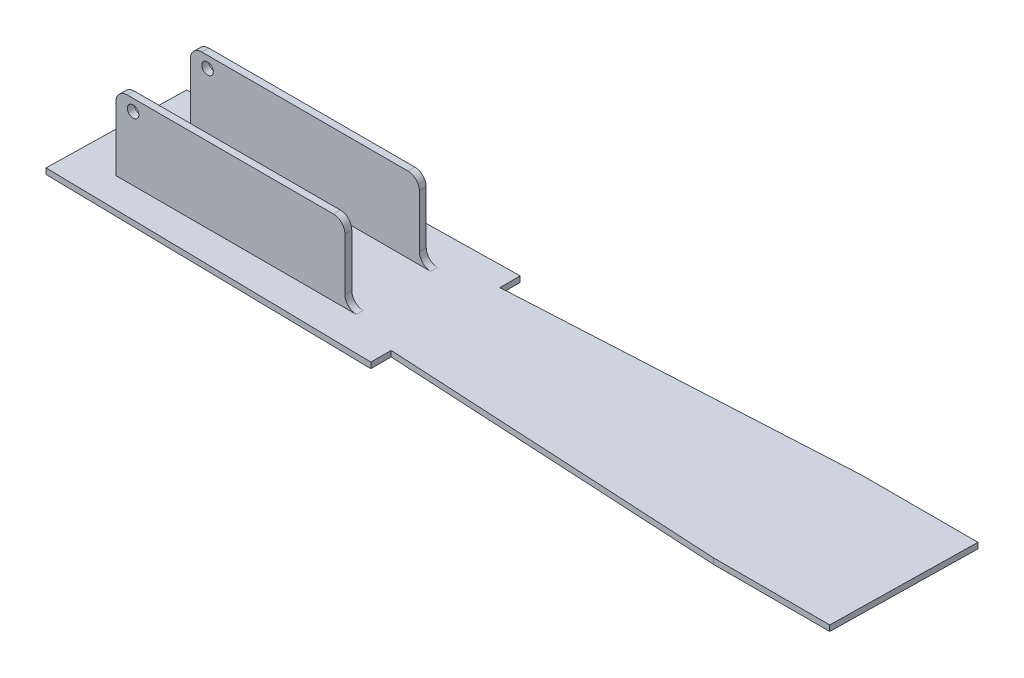
ISO-10303-21;
HEADER;
FILE_DESCRIPTION(('STEP AP214'),'2;1');
FILE_NAME('part.step','',(''),(''),'','','');
FILE_SCHEMA(('AUTOMOTIVE_DESIGN { 1 0 10303 214 1 1 1 1 }'));
ENDSEC;
DATA;
#1=APPLICATION_CONTEXT('core data for automotive mechanical design processes');
#2=APPLICATION_PROTOCOL_DEFINITION('international standard','automotive_design',2000,#1);
#3=PRODUCT_CONTEXT('',#1,'mechanical');
#4=PRODUCT('Part','Part','',(#3));
#5=PRODUCT_RELATED_PRODUCT_CATEGORY('part','',(#4));
#6=PRODUCT_DEFINITION_FORMATION('','',#4);
#7=PRODUCT_DEFINITION_CONTEXT('part definition',#1,'design');
#8=PRODUCT_DEFINITION('design','',#6,#7);
#9=PRODUCT_DEFINITION_SHAPE('','',#8);
#10=(LENGTH_UNIT() NAMED_UNIT(*) SI_UNIT(.MILLI.,.METRE.));
#11=(NAMED_UNIT(*) PLANE_ANGLE_UNIT() SI_UNIT($,.RADIAN.));
#12=(NAMED_UNIT(*) SI_UNIT($,.STERADIAN.) SOLID_ANGLE_UNIT());
#13=UNCERTAINTY_MEASURE_WITH_UNIT(LENGTH_MEASURE(1.E-05),#10,'distance_accuracy_value','');
#14=(GEOMETRIC_REPRESENTATION_CONTEXT(3) GLOBAL_UNCERTAINTY_ASSIGNED_CONTEXT((#13)) GLOBAL_UNIT_ASSIGNED_CONTEXT((#10,
#11,#12)) REPRESENTATION_CONTEXT('',''));
#15=CARTESIAN_POINT('',(0.,0.,0.));
#16=DIRECTION('',(0.,0.,1.));
#17=DIRECTION('',(1.,0.,0.));
#18=AXIS2_PLACEMENT_3D('',#15,#16,#17);
#19=CARTESIAN_POINT('',(0.,1.26999999999999,0.));
#20=DIRECTION('',(0.,-1.,0.));
#21=DIRECTION('',(0.,0.,-1.));
#22=AXIS2_PLACEMENT_3D('',#19,#20,#21);
#23=PLANE('',#22);
#24=CARTESIAN_POINT('',(-58.141999981168,1.26999999999999,-0.00550365632334682));
#25=DIRECTION('',(0.,1.,0.));
#26=DIRECTION('',(0.,0.,1.));
#27=AXIS2_PLACEMENT_3D('',#24,#25,#26);
#28=CIRCLE('',#27,1.27);
#29=CARTESIAN_POINT('',(-58.141999981168,1.26999999999999,1.26449634367665));
#30=VERTEX_POINT('',#29);
#31=EDGE_CURVE('E643',#30,#30,#28,.T.);
#32=ORIENTED_EDGE('',*,*,#31,.F.);
#33=EDGE_LOOP('',(#32));
#34=FACE_BOUND('',#33,.T.);
#35=DIRECTION('',(-1.,0.,0.));
#36=VECTOR('',#35,1.);
#37=CARTESIAN_POINT('',(-78.418825687294,1.26999999999999,-9.02250365632318));
#38=LINE('',#37,#36);
#39=CARTESIAN_POINT('',(-25.078825687294,1.26999999999999,-9.02250365632318));
#40=VERTEX_POINT('',#39);
#41=CARTESIAN_POINT('',(-78.418825687294,1.26999999999999,-9.02250365632318));
#42=VERTEX_POINT('',#41);
#43=EDGE_CURVE('E237',#40,#42,#38,.T.);
#44=ORIENTED_EDGE('',*,*,#43,.F.);
#45=DIRECTION('',(0.,0.,-1.));
#46=VECTOR('',#45,1.);
#47=CARTESIAN_POINT('',(-25.078825687294,1.26999999999999,-7.49850365632332));
#48=LINE('',#47,#46);
#49=CARTESIAN_POINT('',(-25.078825687294,1.26999999999999,-7.49850365632332));
#50=VERTEX_POINT('',#49);
#51=EDGE_CURVE('E405',#40,#50,#48,.F.);
#52=ORIENTED_EDGE('',*,*,#51,.T.);
#53=DIRECTION('',(1.,0.,0.));
#54=VECTOR('',#53,1.);
#55=CARTESIAN_POINT('',(-78.418825687294,1.26999999999999,-7.49850365632332));
#56=LINE('',#55,#54);
#57=CARTESIAN_POINT('',(-78.418825687294,1.26999999999999,-7.49850365632332));
#58=VERTEX_POINT('',#57);
#59=EDGE_CURVE('E260',#58,#50,#56,.T.);
#60=ORIENTED_EDGE('',*,*,#59,.F.);
#61=DIRECTION('',(0.,0.,1.));
#62=VECTOR('',#61,1.);
#63=CARTESIAN_POINT('',(-78.418825687294,1.26999999999999,-9.02250365632318));
#64=LINE('',#63,#62);
#65=EDGE_CURVE('E268',#42,#58,#64,.T.);
#66=ORIENTED_EDGE('',*,*,#65,.F.);
#67=EDGE_LOOP('',(#44,#52,#60,#66));
#68=FACE_BOUND('',#67,.T.);
#69=DIRECTION('',(-1.,0.,0.));
#70=VECTOR('',#69,1.);
#71=CARTESIAN_POINT('',(61.890036883109,1.26999999999999,-16.1607500000001));
#72=LINE('',#71,#70);
#73=CARTESIAN_POINT('',(87.6673042407577,1.26999999999999,-16.1607500000001));
#74=VERTEX_POINT('',#73);
#75=CARTESIAN_POINT('',(61.890036883109,1.26999999999999,-16.1607500000001));
#76=VERTEX_POINT('',#75);
#77=EDGE_CURVE('E288',#74,#76,#72,.T.);
#78=ORIENTED_EDGE('',*,*,#77,.T.);
#79=DIRECTION('',(-0.998558591239147,0.,0.0536725242791041));
#80=VECTOR('',#79,1.);
#81=CARTESIAN_POINT('',(-14.309963116891,1.26999999999999,-12.065));
#82=LINE('',#81,#80);
#83=CARTESIAN_POINT('',(-14.309963116891,1.26999999999999,-12.065));
#84=VERTEX_POINT('',#83);
#85=EDGE_CURVE('E292',#76,#84,#82,.T.);
#86=ORIENTED_EDGE('',*,*,#85,.T.);
#87=DIRECTION('',(0.,0.,-1.));
#88=VECTOR('',#87,1.);
#89=CARTESIAN_POINT('',(-14.309963116891,1.26999999999999,-16.5700759475302));
#90=LINE('',#89,#88);
#91=CARTESIAN_POINT('',(-14.309963116891,1.26999999999999,-16.5700759475302));
#92=VERTEX_POINT('',#91);
#93=EDGE_CURVE('E296',#84,#92,#90,.T.);
#94=ORIENTED_EDGE('',*,*,#93,.T.);
#95=DIRECTION('',(-0.999847695156391,0.,0.0174524064372836));
#96=VECTOR('',#95,1.);
#97=CARTESIAN_POINT('',(-87.0366957215782,1.26999999999999,-15.3006261078983));
#98=LINE('',#97,#96);
#99=CARTESIAN_POINT('',(-87.0366957215782,1.26999999999999,-15.3006261078983));
#100=VERTEX_POINT('',#99);
#101=EDGE_CURVE('E299',#92,#100,#98,.T.);
#102=ORIENTED_EDGE('',*,*,#101,.T.);
#103=DIRECTION('',(-0.020610314510683,0.,0.9997875849078));
#104=VECTOR('',#103,1.);
#105=CARTESIAN_POINT('',(-87.6673042407577,1.26999999999999,15.2896187952516));
#106=LINE('',#105,#104);
#107=CARTESIAN_POINT('',(-87.6673042407577,1.26999999999999,15.2896187952516));
#108=VERTEX_POINT('',#107);
#109=EDGE_CURVE('E302',#100,#108,#106,.T.);
#110=ORIENTED_EDGE('',*,*,#109,.T.);
#111=DIRECTION('',(0.999847695156391,0.,0.0174524064372836));
#112=VECTOR('',#111,1.);
#113=CARTESIAN_POINT('',(-14.309963116891,1.26999999999999,16.5700759475302));
#114=LINE('',#113,#112);
#115=CARTESIAN_POINT('',(-14.309963116891,1.26999999999999,16.5700759475302));
#116=VERTEX_POINT('',#115);
#117=EDGE_CURVE('E305',#108,#116,#114,.T.);
#118=ORIENTED_EDGE('',*,*,#117,.T.);
#119=DIRECTION('',(0.,0.,-1.));
#120=VECTOR('',#119,1.);
#121=CARTESIAN_POINT('',(-14.309963116891,1.26999999999999,12.065));
#122=LINE('',#121,#120);
#123=CARTESIAN_POINT('',(-14.309963116891,1.26999999999999,12.065));
#124=VERTEX_POINT('',#123);
#125=EDGE_CURVE('E308',#116,#124,#122,.T.);
#126=ORIENTED_EDGE('',*,*,#125,.T.);
#127=DIRECTION('',(0.998536688659021,0.,0.0540784744780849));
#128=VECTOR('',#127,1.);
#129=CARTESIAN_POINT('',(61.3163684696733,1.26999999999999,16.1607500000001));
#130=LINE('',#129,#128);
#131=CARTESIAN_POINT('',(61.3163684696733,1.26999999999999,16.1607500000001));
#132=VERTEX_POINT('',#131);
#133=EDGE_CURVE('E311',#124,#132,#130,.T.);
#134=ORIENTED_EDGE('',*,*,#133,.T.);
#135=DIRECTION('',(1.,0.,0.));
#136=VECTOR('',#135,1.);
#137=CARTESIAN_POINT('',(87.0936358273219,1.26999999999999,16.1607500000001));
#138=LINE('',#137,#136);
#139=CARTESIAN_POINT('',(87.0936358273219,1.26999999999999,16.1607500000001));
#140=VERTEX_POINT('',#139);
#141=EDGE_CURVE('E314',#132,#140,#138,.T.);
#142=ORIENTED_EDGE('',*,*,#141,.T.);
#143=DIRECTION('',(0.0177460228056984,0.,-0.999842526938407));
#144=VECTOR('',#143,1.);
#145=CARTESIAN_POINT('',(87.6673042407577,1.26999999999999,-16.1607500000001));
#146=LINE('',#145,#144);
#147=EDGE_CURVE('E317',#140,#74,#146,.T.);
#148=ORIENTED_EDGE('',*,*,#147,.T.);
#149=EDGE_LOOP('',(#78,#86,#94,#102,#110,#118,#126,#134,#142,#148));
#150=FACE_BOUND('',#149,.T.);
#151=DIRECTION('',(-1.,0.,0.));
#152=VECTOR('',#151,1.);
#153=CARTESIAN_POINT('',(-78.418825687294,1.26999999999999,7.49850365632332));
#154=LINE('',#153,#152);
#155=CARTESIAN_POINT('',(-25.078825687294,1.26999999999999,7.49850365632332));
#156=VERTEX_POINT('',#155);
#157=CARTESIAN_POINT('',(-78.418825687294,1.26999999999999,7.49850365632332));
#158=VERTEX_POINT('',#157);
#159=EDGE_CURVE('E233',#156,#158,#154,.T.);
#160=ORIENTED_EDGE('',*,*,#159,.F.);
#161=DIRECTION('',(0.,0.,-1.));
#162=VECTOR('',#161,1.);
#163=CARTESIAN_POINT('',(-25.078825687294,1.26999999999999,9.0225036563234));
#164=LINE('',#163,#162);
#165=CARTESIAN_POINT('',(-25.078825687294,1.26999999999999,9.0225036563234));
#166=VERTEX_POINT('',#165);
#167=EDGE_CURVE('E402',#156,#166,#164,.F.);
#168=ORIENTED_EDGE('',*,*,#167,.T.);
#169=DIRECTION('',(1.,0.,0.));
#170=VECTOR('',#169,1.);
#171=CARTESIAN_POINT('',(-78.418825687294,1.26999999999999,9.0225036563234));
#172=LINE('',#171,#170);
#173=CARTESIAN_POINT('',(-78.418825687294,1.26999999999999,9.0225036563234));
#174=VERTEX_POINT('',#173);
#175=EDGE_CURVE('E235',#174,#166,#172,.T.);
#176=ORIENTED_EDGE('',*,*,#175,.F.);
#177=DIRECTION('',(0.,0.,1.));
#178=VECTOR('',#177,1.);
#179=CARTESIAN_POINT('',(-78.418825687294,1.26999999999999,9.0225036563234));
#180=LINE('',#179,#178);
#181=EDGE_CURVE('E222',#158,#174,#180,.T.);
#182=ORIENTED_EDGE('',*,*,#181,.F.);
#183=EDGE_LOOP('',(#160,#168,#176,#182));
#184=FACE_BOUND('',#183,.T.);
#185=ADVANCED_FACE('F59',(#34,#68,#150,#184),#23,.F.);
#186=CARTESIAN_POINT('',(61.890036883109,1.26999999999999,-16.1607500000001));
#187=DIRECTION('',(0.,0.,1.));
#188=DIRECTION('',(1.,0.,0.));
#189=AXIS2_PLACEMENT_3D('',#186,#187,#188);
#190=PLANE('',#189);
#191=DIRECTION('',(-1.,0.,0.));
#192=VECTOR('',#191,1.);
#193=CARTESIAN_POINT('',(61.890036883109,0.,-16.1607500000001));
#194=LINE('',#193,#192);
#195=CARTESIAN_POINT('',(87.6673042407577,0.,-16.1607500000001));
#196=VERTEX_POINT('',#195);
#197=CARTESIAN_POINT('',(61.890036883109,0.,-16.1607500000001));
#198=VERTEX_POINT('',#197);
#199=EDGE_CURVE('E287',#196,#198,#194,.T.);
#200=ORIENTED_EDGE('',*,*,#199,.T.);
#201=DIRECTION('',(0.,-1.,0.));
#202=VECTOR('',#201,1.);
#203=CARTESIAN_POINT('',(61.890036883109,1.26999999999999,-16.1607500000001));
#204=LINE('',#203,#202);
#205=EDGE_CURVE('E385',#76,#198,#204,.T.);
#206=ORIENTED_EDGE('',*,*,#205,.F.);
#207=ORIENTED_EDGE('',*,*,#77,.F.);
#208=DIRECTION('',(0.,-1.,0.));
#209=VECTOR('',#208,1.);
#210=CARTESIAN_POINT('',(87.6673042407577,1.26999999999999,-16.1607500000001));
#211=LINE('',#210,#209);
#212=EDGE_CURVE('E320',#74,#196,#211,.T.);
#213=ORIENTED_EDGE('',*,*,#212,.T.);
#214=EDGE_LOOP('',(#200,#206,#207,#213));
#215=FACE_BOUND('',#214,.T.);
#216=ADVANCED_FACE('F504',(#215),#190,.F.);
#217=CARTESIAN_POINT('',(-14.309963116891,1.26999999999999,-12.065));
#218=DIRECTION('',(0.0536725242791041,0.,0.998558591239147));
#219=DIRECTION('',(0.998558591239147,0.,-0.0536725242791041));
#220=AXIS2_PLACEMENT_3D('',#217,#218,#219);
#221=PLANE('',#220);
#222=DIRECTION('',(-0.998558591239147,0.,0.0536725242791041));
#223=VECTOR('',#222,1.);
#224=CARTESIAN_POINT('',(-14.309963116891,0.,-12.065));
#225=LINE('',#224,#223);
#226=CARTESIAN_POINT('',(-14.309963116891,0.,-12.065));
#227=VERTEX_POINT('',#226);
#228=EDGE_CURVE('E324',#198,#227,#225,.T.);
#229=ORIENTED_EDGE('',*,*,#228,.T.);
#230=DIRECTION('',(0.,-1.,0.));
#231=VECTOR('',#230,1.);
#232=CARTESIAN_POINT('',(-14.309963116891,1.26999999999999,-12.065));
#233=LINE('',#232,#231);
#234=EDGE_CURVE('E381',#84,#227,#233,.T.);
#235=ORIENTED_EDGE('',*,*,#234,.F.);
#236=ORIENTED_EDGE('',*,*,#85,.F.);
#237=ORIENTED_EDGE('',*,*,#205,.T.);
#238=EDGE_LOOP('',(#229,#235,#236,#237));
#239=FACE_BOUND('',#238,.T.);
#240=ADVANCED_FACE('F515',(#239),#221,.F.);
#241=CARTESIAN_POINT('',(-14.309963116891,1.26999999999999,-16.5700759475302));
#242=DIRECTION('',(-1.,0.,0.));
#243=DIRECTION('',(0.,0.,1.));
#244=AXIS2_PLACEMENT_3D('',#241,#242,#243);
#245=PLANE('',#244);
#246=DIRECTION('',(0.,0.,-1.));
#247=VECTOR('',#246,1.);
#248=CARTESIAN_POINT('',(-14.309963116891,0.,-16.5700759475302));
#249=LINE('',#248,#247);
#250=CARTESIAN_POINT('',(-14.309963116891,0.,-16.5700759475302));
#251=VERTEX_POINT('',#250);
#252=EDGE_CURVE('E327',#227,#251,#249,.T.);
#253=ORIENTED_EDGE('',*,*,#252,.T.);
#254=DIRECTION('',(0.,-1.,0.));
#255=VECTOR('',#254,1.);
#256=CARTESIAN_POINT('',(-14.309963116891,1.26999999999999,-16.5700759475302));
#257=LINE('',#256,#255);
#258=EDGE_CURVE('E377',#92,#251,#257,.T.);
#259=ORIENTED_EDGE('',*,*,#258,.F.);
#260=ORIENTED_EDGE('',*,*,#93,.F.);
#261=ORIENTED_EDGE('',*,*,#234,.T.);
#262=EDGE_LOOP('',(#253,#259,#260,#261));
#263=FACE_BOUND('',#262,.T.);
#264=ADVANCED_FACE('F520',(#263),#245,.F.);
#265=CARTESIAN_POINT('',(-87.0366957215782,1.26999999999999,-15.3006261078983));
#266=DIRECTION('',(0.0174524064372836,0.,0.999847695156391));
#267=DIRECTION('',(0.999847695156391,0.,-0.0174524064372836));
#268=AXIS2_PLACEMENT_3D('',#265,#266,#267);
#269=PLANE('',#268);
#270=DIRECTION('',(-0.999847695156391,0.,0.0174524064372836));
#271=VECTOR('',#270,1.);
#272=CARTESIAN_POINT('',(-87.0366957215782,0.,-15.3006261078983));
#273=LINE('',#272,#271);
#274=CARTESIAN_POINT('',(-87.0366957215782,0.,-15.3006261078983));
#275=VERTEX_POINT('',#274);
#276=EDGE_CURVE('E330',#251,#275,#273,.T.);
#277=ORIENTED_EDGE('',*,*,#276,.T.);
#278=DIRECTION('',(0.,-1.,0.));
#279=VECTOR('',#278,1.);
#280=CARTESIAN_POINT('',(-87.0366957215782,1.26999999999999,-15.3006261078983));
#281=LINE('',#280,#279);
#282=EDGE_CURVE('E373',#100,#275,#281,.T.);
#283=ORIENTED_EDGE('',*,*,#282,.F.);
#284=ORIENTED_EDGE('',*,*,#101,.F.);
#285=ORIENTED_EDGE('',*,*,#258,.T.);
#286=EDGE_LOOP('',(#277,#283,#284,#285));
#287=FACE_BOUND('',#286,.T.);
#288=ADVANCED_FACE('F526',(#287),#269,.F.);
#289=CARTESIAN_POINT('',(-87.6673042407577,1.26999999999999,15.2896187952516));
#290=DIRECTION('',(0.9997875849078,0.,0.020610314510683));
#291=DIRECTION('',(0.020610314510683,0.,-0.9997875849078));
#292=AXIS2_PLACEMENT_3D('',#289,#290,#291);
#293=PLANE('',#292);
#294=DIRECTION('',(-0.020610314510683,0.,0.9997875849078));
#295=VECTOR('',#294,1.);
#296=CARTESIAN_POINT('',(-87.6673042407577,0.,15.2896187952516));
#297=LINE('',#296,#295);
#298=CARTESIAN_POINT('',(-87.6673042407577,0.,15.2896187952516));
#299=VERTEX_POINT('',#298);
#300=EDGE_CURVE('E333',#275,#299,#297,.T.);
#301=ORIENTED_EDGE('',*,*,#300,.T.);
#302=DIRECTION('',(0.,-1.,0.));
#303=VECTOR('',#302,1.);
#304=CARTESIAN_POINT('',(-87.6673042407577,1.26999999999999,15.2896187952516));
#305=LINE('',#304,#303);
#306=EDGE_CURVE('E369',#108,#299,#305,.T.);
#307=ORIENTED_EDGE('',*,*,#306,.F.);
#308=ORIENTED_EDGE('',*,*,#109,.F.);
#309=ORIENTED_EDGE('',*,*,#282,.T.);
#310=EDGE_LOOP('',(#301,#307,#308,#309));
#311=FACE_BOUND('',#310,.T.);
#312=ADVANCED_FACE('F530',(#311),#293,.F.);
#313=CARTESIAN_POINT('',(-14.309963116891,1.26999999999999,16.5700759475302));
#314=DIRECTION('',(0.0174524064372836,0.,-0.999847695156391));
#315=DIRECTION('',(-0.999847695156391,0.,-0.0174524064372836));
#316=AXIS2_PLACEMENT_3D('',#313,#314,#315);
#317=PLANE('',#316);
#318=DIRECTION('',(0.999847695156391,0.,0.0174524064372836));
#319=VECTOR('',#318,1.);
#320=CARTESIAN_POINT('',(-14.309963116891,0.,16.5700759475302));
#321=LINE('',#320,#319);
#322=CARTESIAN_POINT('',(-14.309963116891,0.,16.5700759475302));
#323=VERTEX_POINT('',#322);
#324=EDGE_CURVE('E336',#299,#323,#321,.T.);
#325=ORIENTED_EDGE('',*,*,#324,.T.);
#326=DIRECTION('',(0.,-1.,0.));
#327=VECTOR('',#326,1.);
#328=CARTESIAN_POINT('',(-14.309963116891,1.26999999999999,16.5700759475302));
#329=LINE('',#328,#327);
#330=EDGE_CURVE('E365',#116,#323,#329,.T.);
#331=ORIENTED_EDGE('',*,*,#330,.F.);
#332=ORIENTED_EDGE('',*,*,#117,.F.);
#333=ORIENTED_EDGE('',*,*,#306,.T.);
#334=EDGE_LOOP('',(#325,#331,#332,#333));
#335=FACE_BOUND('',#334,.T.);
#336=ADVANCED_FACE('F535',(#335),#317,.F.);
#337=CARTESIAN_POINT('',(-14.309963116891,1.26999999999999,12.065));
#338=DIRECTION('',(-1.,0.,0.));
#339=DIRECTION('',(0.,0.,1.));
#340=AXIS2_PLACEMENT_3D('',#337,#338,#339);
#341=PLANE('',#340);
#342=DIRECTION('',(0.,0.,-1.));
#343=VECTOR('',#342,1.);
#344=CARTESIAN_POINT('',(-14.309963116891,0.,12.065));
#345=LINE('',#344,#343);
#346=CARTESIAN_POINT('',(-14.309963116891,0.,12.065));
#347=VERTEX_POINT('',#346);
#348=EDGE_CURVE('E339',#323,#347,#345,.T.);
#349=ORIENTED_EDGE('',*,*,#348,.T.);
#350=DIRECTION('',(0.,-1.,0.));
#351=VECTOR('',#350,1.);
#352=CARTESIAN_POINT('',(-14.309963116891,1.26999999999999,12.065));
#353=LINE('',#352,#351);
#354=EDGE_CURVE('E361',#124,#347,#353,.T.);
#355=ORIENTED_EDGE('',*,*,#354,.F.);
#356=ORIENTED_EDGE('',*,*,#125,.F.);
#357=ORIENTED_EDGE('',*,*,#330,.T.);
#358=EDGE_LOOP('',(#349,#355,#356,#357));
#359=FACE_BOUND('',#358,.T.);
#360=ADVANCED_FACE('F541',(#359),#341,.F.);
#361=CARTESIAN_POINT('',(61.3163684696733,1.26999999999999,16.1607500000001));
#362=DIRECTION('',(0.0540784744780849,0.,-0.998536688659021));
#363=DIRECTION('',(-0.998536688659021,0.,-0.0540784744780849));
#364=AXIS2_PLACEMENT_3D('',#361,#362,#363);
#365=PLANE('',#364);
#366=DIRECTION('',(0.998536688659021,0.,0.0540784744780849));
#367=VECTOR('',#366,1.);
#368=CARTESIAN_POINT('',(61.3163684696733,0.,16.1607500000001));
#369=LINE('',#368,#367);
#370=CARTESIAN_POINT('',(61.3163684696733,0.,16.1607500000001));
#371=VERTEX_POINT('',#370);
#372=EDGE_CURVE('E342',#347,#371,#369,.T.);
#373=ORIENTED_EDGE('',*,*,#372,.T.);
#374=DIRECTION('',(0.,-1.,0.));
#375=VECTOR('',#374,1.);
#376=CARTESIAN_POINT('',(61.3163684696733,1.26999999999999,16.1607500000001));
#377=LINE('',#376,#375);
#378=EDGE_CURVE('E357',#132,#371,#377,.T.);
#379=ORIENTED_EDGE('',*,*,#378,.F.);
#380=ORIENTED_EDGE('',*,*,#133,.F.);
#381=ORIENTED_EDGE('',*,*,#354,.T.);
#382=EDGE_LOOP('',(#373,#379,#380,#381));
#383=FACE_BOUND('',#382,.T.);
#384=ADVANCED_FACE('F545',(#383),#365,.F.);
#385=CARTESIAN_POINT('',(87.0936358273219,1.26999999999999,16.1607500000001));
#386=DIRECTION('',(0.,0.,-1.));
#387=DIRECTION('',(-1.,0.,0.));
#388=AXIS2_PLACEMENT_3D('',#385,#386,#387);
#389=PLANE('',#388);
#390=DIRECTION('',(1.,0.,0.));
#391=VECTOR('',#390,1.);
#392=CARTESIAN_POINT('',(87.0936358273219,0.,16.1607500000001));
#393=LINE('',#392,#391);
#394=CARTESIAN_POINT('',(87.0936358273219,0.,16.1607500000001));
#395=VERTEX_POINT('',#394);
#396=EDGE_CURVE('E345',#371,#395,#393,.T.);
#397=ORIENTED_EDGE('',*,*,#396,.T.);
#398=DIRECTION('',(0.,-1.,0.));
#399=VECTOR('',#398,1.);
#400=CARTESIAN_POINT('',(87.0936358273219,1.26999999999999,16.1607500000001));
#401=LINE('',#400,#399);
#402=EDGE_CURVE('E353',#140,#395,#401,.T.);
#403=ORIENTED_EDGE('',*,*,#402,.F.);
#404=ORIENTED_EDGE('',*,*,#141,.F.);
#405=ORIENTED_EDGE('',*,*,#378,.T.);
#406=EDGE_LOOP('',(#397,#403,#404,#405));
#407=FACE_BOUND('',#406,.T.);
#408=ADVANCED_FACE('F550',(#407),#389,.F.);
#409=CARTESIAN_POINT('',(87.6673042407577,1.26999999999999,-16.1607500000001));
#410=DIRECTION('',(-0.999842526938407,0.,-0.0177460228056984));
#411=DIRECTION('',(-0.0177460228056984,0.,0.999842526938407));
#412=AXIS2_PLACEMENT_3D('',#409,#410,#411);
#413=PLANE('',#412);
#414=DIRECTION('',(0.0177460228056984,0.,-0.999842526938407));
#415=VECTOR('',#414,1.);
#416=CARTESIAN_POINT('',(87.6673042407577,0.,-16.1607500000001));
#417=LINE('',#416,#415);
#418=EDGE_CURVE('E293',#395,#196,#417,.T.);
#419=ORIENTED_EDGE('',*,*,#418,.T.);
#420=ORIENTED_EDGE('',*,*,#212,.F.);
#421=ORIENTED_EDGE('',*,*,#147,.F.);
#422=ORIENTED_EDGE('',*,*,#402,.T.);
#423=EDGE_LOOP('',(#419,#420,#421,#422));
#424=FACE_BOUND('',#423,.T.);
#425=ADVANCED_FACE('F553',(#424),#413,.F.);
#426=CARTESIAN_POINT('',(0.,0.,0.));
#427=DIRECTION('',(0.,-1.,0.));
#428=DIRECTION('',(0.,0.,-1.));
#429=AXIS2_PLACEMENT_3D('',#426,#427,#428);
#430=PLANE('',#429);
#431=CARTESIAN_POINT('',(-58.141999981168,0.,-0.00550365632334682));
#432=DIRECTION('',(0.,-1.,0.));
#433=DIRECTION('',(0.,0.,-1.));
#434=AXIS2_PLACEMENT_3D('',#431,#432,#433);
#435=CIRCLE('',#434,1.27);
#436=CARTESIAN_POINT('',(-58.141999981168,0.,-1.27550365632334));
#437=VERTEX_POINT('',#436);
#438=EDGE_CURVE('E63',#437,#437,#435,.T.);
#439=ORIENTED_EDGE('',*,*,#438,.F.);
#440=EDGE_LOOP('',(#439));
#441=FACE_BOUND('',#440,.T.);
#442=ORIENTED_EDGE('',*,*,#199,.F.);
#443=ORIENTED_EDGE('',*,*,#418,.F.);
#444=ORIENTED_EDGE('',*,*,#396,.F.);
#445=ORIENTED_EDGE('',*,*,#372,.F.);
#446=ORIENTED_EDGE('',*,*,#348,.F.);
#447=ORIENTED_EDGE('',*,*,#324,.F.);
#448=ORIENTED_EDGE('',*,*,#300,.F.);
#449=ORIENTED_EDGE('',*,*,#276,.F.);
#450=ORIENTED_EDGE('',*,*,#252,.F.);
#451=ORIENTED_EDGE('',*,*,#228,.F.);
#452=EDGE_LOOP('',(#442,#443,#444,#445,#446,#447,#448,#449,#450,#451));
#453=FACE_BOUND('',#452,.T.);
#454=ADVANCED_FACE('F555',(#441,#453),#430,.T.);
#455=CARTESIAN_POINT('',(-27.618825687294,18.034,-9.02250365632318));
#456=DIRECTION('',(-1.,0.,0.));
#457=DIRECTION('',(0.,0.,1.));
#458=AXIS2_PLACEMENT_3D('',#455,#456,#457);
#459=PLANE('',#458);
#460=DIRECTION('',(0.,-1.,0.));
#461=VECTOR('',#460,1.);
#462=CARTESIAN_POINT('',(-27.618825687294,18.034,-7.49850365632332));
#463=LINE('',#462,#461);
#464=CARTESIAN_POINT('',(-27.618825687294,15.494,-7.49850365632332));
#465=VERTEX_POINT('',#464);
#466=CARTESIAN_POINT('',(-27.618825687294,3.80999999999998,-7.49850365632332));
#467=VERTEX_POINT('',#466);
#468=EDGE_CURVE('E264',#465,#467,#463,.T.);
#469=ORIENTED_EDGE('',*,*,#468,.T.);
#470=DIRECTION('',(0.,0.,-1.));
#471=VECTOR('',#470,1.);
#472=CARTESIAN_POINT('',(-27.618825687294,3.80999999999998,-9.02250365632318));
#473=LINE('',#472,#471);
#474=CARTESIAN_POINT('',(-27.618825687294,3.80999999999998,-9.02250365632318));
#475=VERTEX_POINT('',#474);
#476=EDGE_CURVE('E398',#467,#475,#473,.T.);
#477=ORIENTED_EDGE('',*,*,#476,.T.);
#478=DIRECTION('',(0.,-1.,0.));
#479=VECTOR('',#478,1.);
#480=CARTESIAN_POINT('',(-27.618825687294,18.034,-9.02250365632318));
#481=LINE('',#480,#479);
#482=CARTESIAN_POINT('',(-27.618825687294,15.494,-9.02250365632318));
#483=VERTEX_POINT('',#482);
#484=EDGE_CURVE('E283',#483,#475,#481,.T.);
#485=ORIENTED_EDGE('',*,*,#484,.F.);
#486=DIRECTION('',(0.,0.,-1.));
#487=VECTOR('',#486,1.);
#488=CARTESIAN_POINT('',(-27.618825687294,15.494,-7.49850365632332));
#489=LINE('',#488,#487);
#490=EDGE_CURVE('E389',#483,#465,#489,.F.);
#491=ORIENTED_EDGE('',*,*,#490,.T.);
#492=EDGE_LOOP('',(#469,#477,#485,#491));
#493=FACE_BOUND('',#492,.T.);
#494=ADVANCED_FACE('F479',(#493),#459,.F.);
#495=CARTESIAN_POINT('',(-78.418825687294,18.034,-9.02250365632318));
#496=DIRECTION('',(0.,0.,1.));
#497=DIRECTION('',(1.,0.,0.));
#498=AXIS2_PLACEMENT_3D('',#495,#496,#497);
#499=PLANE('',#498);
#500=CARTESIAN_POINT('',(-74.608825687294,15.494,-9.02250365632318));
#501=DIRECTION('',(0.,0.,1.));
#502=DIRECTION('',(1.,0.,0.));
#503=AXIS2_PLACEMENT_3D('',#500,#501,#502);
#504=CIRCLE('',#503,1.26999999999999);
#505=CARTESIAN_POINT('',(-73.338825687294,15.494,-9.02250365632318));
#506=VERTEX_POINT('',#505);
#507=EDGE_CURVE('E633',#506,#506,#504,.T.);
#508=ORIENTED_EDGE('',*,*,#507,.T.);
#509=EDGE_LOOP('',(#508));
#510=FACE_BOUND('',#509,.T.);
#511=DIRECTION('',(0.,-1.,0.));
#512=VECTOR('',#511,1.);
#513=CARTESIAN_POINT('',(-78.418825687294,18.034,-9.02250365632318));
#514=LINE('',#513,#512);
#515=CARTESIAN_POINT('',(-78.418825687294,15.494,-9.02250365632318));
#516=VERTEX_POINT('',#515);
#517=EDGE_CURVE('E280',#516,#42,#514,.T.);
#518=ORIENTED_EDGE('',*,*,#517,.F.);
#519=CARTESIAN_POINT('',(-75.878825687294,15.494,-9.02250365632318));
#520=DIRECTION('',(0.,0.,1.));
#521=DIRECTION('',(1.,0.,0.));
#522=AXIS2_PLACEMENT_3D('',#519,#520,#521);
#523=CIRCLE('',#522,2.54);
#524=CARTESIAN_POINT('',(-75.878825687294,18.034,-9.02250365632318));
#525=VERTEX_POINT('',#524);
#526=EDGE_CURVE('E436',#516,#525,#523,.F.);
#527=ORIENTED_EDGE('',*,*,#526,.T.);
#528=DIRECTION('',(-1.,0.,0.));
#529=VECTOR('',#528,1.);
#530=CARTESIAN_POINT('',(-78.418825687294,18.034,-9.02250365632318));
#531=LINE('',#530,#529);
#532=CARTESIAN_POINT('',(-30.158825687294,18.034,-9.02250365632318));
#533=VERTEX_POINT('',#532);
#534=EDGE_CURVE('E255',#533,#525,#531,.T.);
#535=ORIENTED_EDGE('',*,*,#534,.F.);
#536=CARTESIAN_POINT('',(-30.158825687294,15.494,-9.02250365632318));
#537=DIRECTION('',(0.,0.,1.));
#538=DIRECTION('',(1.,0.,0.));
#539=AXIS2_PLACEMENT_3D('',#536,#537,#538);
#540=CIRCLE('',#539,2.54);
#541=EDGE_CURVE('E433',#533,#483,#540,.F.);
#542=ORIENTED_EDGE('',*,*,#541,.T.);
#543=ORIENTED_EDGE('',*,*,#484,.T.);
#544=CARTESIAN_POINT('',(-25.078825687294,3.80999999999998,-9.02250365632318));
#545=DIRECTION('',(0.,0.,1.));
#546=DIRECTION('',(1.,0.,0.));
#547=AXIS2_PLACEMENT_3D('',#544,#545,#546);
#548=CIRCLE('',#547,2.54);
#549=EDGE_CURVE('E460',#475,#40,#548,.T.);
#550=ORIENTED_EDGE('',*,*,#549,.T.);
#551=ORIENTED_EDGE('',*,*,#43,.T.);
#552=EDGE_LOOP('',(#518,#527,#535,#542,#543,#550,#551));
#553=FACE_BOUND('',#552,.T.);
#554=ADVANCED_FACE('F485',(#510,#553),#499,.F.);
#555=CARTESIAN_POINT('',(-78.418825687294,18.034,-9.02250365632318));
#556=DIRECTION('',(1.,0.,0.));
#557=DIRECTION('',(0.,0.,-1.));
#558=AXIS2_PLACEMENT_3D('',#555,#556,#557);
#559=PLANE('',#558);
#560=DIRECTION('',(0.,-1.,0.));
#561=VECTOR('',#560,1.);
#562=CARTESIAN_POINT('',(-78.418825687294,18.034,-7.49850365632332));
#563=LINE('',#562,#561);
#564=CARTESIAN_POINT('',(-78.418825687294,15.494,-7.49850365632332));
#565=VERTEX_POINT('',#564);
#566=EDGE_CURVE('E277',#565,#58,#563,.T.);
#567=ORIENTED_EDGE('',*,*,#566,.F.);
#568=DIRECTION('',(0.,0.,1.));
#569=VECTOR('',#568,1.);
#570=CARTESIAN_POINT('',(-78.418825687294,15.494,-9.02250365632318));
#571=LINE('',#570,#569);
#572=EDGE_CURVE('E430',#565,#516,#571,.F.);
#573=ORIENTED_EDGE('',*,*,#572,.T.);
#574=ORIENTED_EDGE('',*,*,#517,.T.);
#575=ORIENTED_EDGE('',*,*,#65,.T.);
#576=EDGE_LOOP('',(#567,#573,#574,#575));
#577=FACE_BOUND('',#576,.T.);
#578=ADVANCED_FACE('F499',(#577),#559,.F.);
#579=CARTESIAN_POINT('',(-78.418825687294,18.034,-7.49850365632332));
#580=DIRECTION('',(0.,0.,-1.));
#581=DIRECTION('',(-1.,0.,0.));
#582=AXIS2_PLACEMENT_3D('',#579,#580,#581);
#583=PLANE('',#582);
#584=CARTESIAN_POINT('',(-74.608825687294,15.494,-7.49850365632332));
#585=DIRECTION('',(0.,0.,-1.));
#586=DIRECTION('',(-1.,0.,0.));
#587=AXIS2_PLACEMENT_3D('',#584,#585,#586);
#588=CIRCLE('',#587,1.26999999999999);
#589=CARTESIAN_POINT('',(-75.878825687294,15.494,-7.49850365632332));
#590=VERTEX_POINT('',#589);
#591=EDGE_CURVE('E394',#590,#590,#588,.T.);
#592=ORIENTED_EDGE('',*,*,#591,.T.);
#593=EDGE_LOOP('',(#592));
#594=FACE_BOUND('',#593,.T.);
#595=DIRECTION('',(1.,0.,0.));
#596=VECTOR('',#595,1.);
#597=CARTESIAN_POINT('',(-78.418825687294,18.034,-7.49850365632332));
#598=LINE('',#597,#596);
#599=CARTESIAN_POINT('',(-75.878825687294,18.034,-7.49850365632332));
#600=VERTEX_POINT('',#599);
#601=CARTESIAN_POINT('',(-30.158825687294,18.034,-7.49850365632332));
#602=VERTEX_POINT('',#601);
#603=EDGE_CURVE('E259',#600,#602,#598,.T.);
#604=ORIENTED_EDGE('',*,*,#603,.F.);
#605=CARTESIAN_POINT('',(-75.878825687294,15.494,-7.49850365632332));
#606=DIRECTION('',(0.,0.,-1.));
#607=DIRECTION('',(-1.,0.,0.));
#608=AXIS2_PLACEMENT_3D('',#605,#606,#607);
#609=CIRCLE('',#608,2.54);
#610=EDGE_CURVE('E427',#600,#565,#609,.F.);
#611=ORIENTED_EDGE('',*,*,#610,.T.);
#612=ORIENTED_EDGE('',*,*,#566,.T.);
#613=ORIENTED_EDGE('',*,*,#59,.T.);
#614=CARTESIAN_POINT('',(-25.078825687294,3.80999999999998,-7.49850365632332));
#615=DIRECTION('',(0.,0.,-1.));
#616=DIRECTION('',(-1.,0.,0.));
#617=AXIS2_PLACEMENT_3D('',#614,#615,#616);
#618=CIRCLE('',#617,2.54);
#619=EDGE_CURVE('E464',#50,#467,#618,.T.);
#620=ORIENTED_EDGE('',*,*,#619,.T.);
#621=ORIENTED_EDGE('',*,*,#468,.F.);
#622=CARTESIAN_POINT('',(-30.158825687294,15.494,-7.49850365632332));
#623=DIRECTION('',(0.,0.,-1.));
#624=DIRECTION('',(-1.,0.,0.));
#625=AXIS2_PLACEMENT_3D('',#622,#623,#624);
#626=CIRCLE('',#625,2.54);
#627=EDGE_CURVE('E424',#465,#602,#626,.F.);
#628=ORIENTED_EDGE('',*,*,#627,.T.);
#629=EDGE_LOOP('',(#604,#611,#612,#613,#620,#621,#628));
#630=FACE_BOUND('',#629,.T.);
#631=ADVANCED_FACE('F472',(#594,#630),#583,.F.);
#632=CARTESIAN_POINT('',(0.,18.034,0.));
#633=DIRECTION('',(0.,1.,0.));
#634=DIRECTION('',(0.,0.,1.));
#635=AXIS2_PLACEMENT_3D('',#632,#633,#634);
#636=PLANE('',#635);
#637=ORIENTED_EDGE('',*,*,#534,.T.);
#638=DIRECTION('',(0.,0.,1.));
#639=VECTOR('',#638,1.);
#640=CARTESIAN_POINT('',(-75.878825687294,18.034,-7.49850365632332));
#641=LINE('',#640,#639);
#642=EDGE_CURVE('E420',#525,#600,#641,.T.);
#643=ORIENTED_EDGE('',*,*,#642,.T.);
#644=ORIENTED_EDGE('',*,*,#603,.T.);
#645=DIRECTION('',(0.,0.,-1.));
#646=VECTOR('',#645,1.);
#647=CARTESIAN_POINT('',(-30.158825687294,18.034,-9.02250365632318));
#648=LINE('',#647,#646);
#649=EDGE_CURVE('E416',#602,#533,#648,.T.);
#650=ORIENTED_EDGE('',*,*,#649,.T.);
#651=EDGE_LOOP('',(#637,#643,#644,#650));
#652=FACE_BOUND('',#651,.T.);
#653=ADVANCED_FACE('F491',(#652),#636,.T.);
#654=CARTESIAN_POINT('',(-78.418825687294,18.034,9.0225036563234));
#655=DIRECTION('',(1.,0.,0.));
#656=DIRECTION('',(0.,0.,-1.));
#657=AXIS2_PLACEMENT_3D('',#654,#655,#656);
#658=PLANE('',#657);
#659=DIRECTION('',(0.,-1.,0.));
#660=VECTOR('',#659,1.);
#661=CARTESIAN_POINT('',(-78.418825687294,18.034,9.0225036563234));
#662=LINE('',#661,#660);
#663=CARTESIAN_POINT('',(-78.418825687294,15.494,9.0225036563234));
#664=VERTEX_POINT('',#663);
#665=EDGE_CURVE('E628',#664,#174,#662,.T.);
#666=ORIENTED_EDGE('',*,*,#665,.F.);
#667=DIRECTION('',(0.,0.,1.));
#668=VECTOR('',#667,1.);
#669=CARTESIAN_POINT('',(-78.418825687294,15.494,9.0225036563234));
#670=LINE('',#669,#668);
#671=CARTESIAN_POINT('',(-78.418825687294,15.494,7.49850365632332));
#672=VERTEX_POINT('',#671);
#673=EDGE_CURVE('E76',#664,#672,#670,.F.);
#674=ORIENTED_EDGE('',*,*,#673,.T.);
#675=DIRECTION('',(0.,-1.,0.));
#676=VECTOR('',#675,1.);
#677=CARTESIAN_POINT('',(-78.418825687294,18.034,7.49850365632332));
#678=LINE('',#677,#676);
#679=EDGE_CURVE('E219',#672,#158,#678,.T.);
#680=ORIENTED_EDGE('',*,*,#679,.T.);
#681=ORIENTED_EDGE('',*,*,#181,.T.);
#682=EDGE_LOOP('',(#666,#674,#680,#681));
#683=FACE_BOUND('',#682,.T.);
#684=ADVANCED_FACE('F221',(#683),#658,.F.);
#685=CARTESIAN_POINT('',(-78.418825687294,18.034,9.0225036563234));
#686=DIRECTION('',(0.,0.,-1.));
#687=DIRECTION('',(-1.,0.,0.));
#688=AXIS2_PLACEMENT_3D('',#685,#686,#687);
#689=PLANE('',#688);
#690=CARTESIAN_POINT('',(-74.608825687294,15.494,9.0225036563234));
#691=DIRECTION('',(0.,0.,1.));
#692=DIRECTION('',(1.,0.,0.));
#693=AXIS2_PLACEMENT_3D('',#690,#691,#692);
#694=CIRCLE('',#693,1.26999999999999);
#695=CARTESIAN_POINT('',(-73.338825687294,15.494,9.0225036563234));
#696=VERTEX_POINT('',#695);
#697=EDGE_CURVE('E395',#696,#696,#694,.T.);
#698=ORIENTED_EDGE('',*,*,#697,.F.);
#699=EDGE_LOOP('',(#698));
#700=FACE_BOUND('',#699,.T.);
#701=DIRECTION('',(1.,0.,0.));
#702=VECTOR('',#701,1.);
#703=CARTESIAN_POINT('',(-78.418825687294,18.034,9.0225036563234));
#704=LINE('',#703,#702);
#705=CARTESIAN_POINT('',(-75.878825687294,18.034,9.0225036563234));
#706=VERTEX_POINT('',#705);
#707=CARTESIAN_POINT('',(-30.158825687294,18.034,9.0225036563234));
#708=VERTEX_POINT('',#707);
#709=EDGE_CURVE('E243',#706,#708,#704,.T.);
#710=ORIENTED_EDGE('',*,*,#709,.F.);
#711=CARTESIAN_POINT('',(-75.878825687294,15.494,9.0225036563234));
#712=DIRECTION('',(0.,0.,-1.));
#713=DIRECTION('',(-1.,0.,0.));
#714=AXIS2_PLACEMENT_3D('',#711,#712,#713);
#715=CIRCLE('',#714,2.54);
#716=EDGE_CURVE('E84',#706,#664,#715,.F.);
#717=ORIENTED_EDGE('',*,*,#716,.T.);
#718=ORIENTED_EDGE('',*,*,#665,.T.);
#719=ORIENTED_EDGE('',*,*,#175,.T.);
#720=CARTESIAN_POINT('',(-25.078825687294,3.80999999999998,9.0225036563234));
#721=DIRECTION('',(0.,0.,-1.));
#722=DIRECTION('',(-1.,0.,0.));
#723=AXIS2_PLACEMENT_3D('',#720,#721,#722);
#724=CIRCLE('',#723,2.54);
#725=CARTESIAN_POINT('',(-27.618825687294,3.80999999999998,9.0225036563234));
#726=VERTEX_POINT('',#725);
#727=EDGE_CURVE('E13',#166,#726,#724,.T.);
#728=ORIENTED_EDGE('',*,*,#727,.T.);
#729=DIRECTION('',(0.,-1.,0.));
#730=VECTOR('',#729,1.);
#731=CARTESIAN_POINT('',(-27.618825687294,18.034,9.0225036563234));
#732=LINE('',#731,#730);
#733=CARTESIAN_POINT('',(-27.618825687294,15.494,9.0225036563234));
#734=VERTEX_POINT('',#733);
#735=EDGE_CURVE('E617',#734,#726,#732,.T.);
#736=ORIENTED_EDGE('',*,*,#735,.F.);
#737=CARTESIAN_POINT('',(-30.158825687294,15.494,9.0225036563234));
#738=DIRECTION('',(0.,0.,-1.));
#739=DIRECTION('',(-1.,0.,0.));
#740=AXIS2_PLACEMENT_3D('',#737,#738,#739);
#741=CIRCLE('',#740,2.54);
#742=EDGE_CURVE('E447',#734,#708,#741,.F.);
#743=ORIENTED_EDGE('',*,*,#742,.T.);
#744=EDGE_LOOP('',(#710,#717,#718,#719,#728,#736,#743));
#745=FACE_BOUND('',#744,.T.);
#746=ADVANCED_FACE('F615',(#700,#745),#689,.F.);
#747=CARTESIAN_POINT('',(-27.618825687294,18.034,9.0225036563234));
#748=DIRECTION('',(-1.,0.,0.));
#749=DIRECTION('',(0.,0.,1.));
#750=AXIS2_PLACEMENT_3D('',#747,#748,#749);
#751=PLANE('',#750);
#752=ORIENTED_EDGE('',*,*,#735,.T.);
#753=DIRECTION('',(0.,0.,-1.));
#754=VECTOR('',#753,1.);
#755=CARTESIAN_POINT('',(-27.618825687294,3.80999999999998,7.49850365632332));
#756=LINE('',#755,#754);
#757=CARTESIAN_POINT('',(-27.618825687294,3.80999999999998,7.49850365632332));
#758=VERTEX_POINT('',#757);
#759=EDGE_CURVE('E412',#726,#758,#756,.T.);
#760=ORIENTED_EDGE('',*,*,#759,.T.);
#761=DIRECTION('',(0.,-1.,0.));
#762=VECTOR('',#761,1.);
#763=CARTESIAN_POINT('',(-27.618825687294,18.034,7.49850365632332));
#764=LINE('',#763,#762);
#765=CARTESIAN_POINT('',(-27.618825687294,15.494,7.49850365632332));
#766=VERTEX_POINT('',#765);
#767=EDGE_CURVE('E228',#766,#758,#764,.T.);
#768=ORIENTED_EDGE('',*,*,#767,.F.);
#769=DIRECTION('',(0.,0.,-1.));
#770=VECTOR('',#769,1.);
#771=CARTESIAN_POINT('',(-27.618825687294,15.494,9.0225036563234));
#772=LINE('',#771,#770);
#773=EDGE_CURVE('E409',#766,#734,#772,.F.);
#774=ORIENTED_EDGE('',*,*,#773,.T.);
#775=EDGE_LOOP('',(#752,#760,#768,#774));
#776=FACE_BOUND('',#775,.T.);
#777=ADVANCED_FACE('F624',(#776),#751,.F.);
#778=CARTESIAN_POINT('',(-78.418825687294,18.034,7.49850365632332));
#779=DIRECTION('',(0.,0.,1.));
#780=DIRECTION('',(1.,0.,0.));
#781=AXIS2_PLACEMENT_3D('',#778,#779,#780);
#782=PLANE('',#781);
#783=CARTESIAN_POINT('',(-74.608825687294,15.494,7.49850365632332));
#784=DIRECTION('',(0.,0.,1.));
#785=DIRECTION('',(1.,0.,0.));
#786=AXIS2_PLACEMENT_3D('',#783,#784,#785);
#787=CIRCLE('',#786,1.26999999999999);
#788=CARTESIAN_POINT('',(-73.338825687294,15.494,7.49850365632332));
#789=VERTEX_POINT('',#788);
#790=EDGE_CURVE('E390',#789,#789,#787,.T.);
#791=ORIENTED_EDGE('',*,*,#790,.T.);
#792=EDGE_LOOP('',(#791));
#793=FACE_BOUND('',#792,.T.);
#794=ORIENTED_EDGE('',*,*,#679,.F.);
#795=CARTESIAN_POINT('',(-75.878825687294,15.494,7.49850365632332));
#796=DIRECTION('',(0.,0.,1.));
#797=DIRECTION('',(1.,0.,0.));
#798=AXIS2_PLACEMENT_3D('',#795,#796,#797);
#799=CIRCLE('',#798,2.54);
#800=CARTESIAN_POINT('',(-75.878825687294,18.034,7.49850365632332));
#801=VERTEX_POINT('',#800);
#802=EDGE_CURVE('E457',#672,#801,#799,.F.);
#803=ORIENTED_EDGE('',*,*,#802,.T.);
#804=DIRECTION('',(-1.,0.,0.));
#805=VECTOR('',#804,1.);
#806=CARTESIAN_POINT('',(-78.418825687294,18.034,7.49850365632332));
#807=LINE('',#806,#805);
#808=CARTESIAN_POINT('',(-30.158825687294,18.034,7.49850365632332));
#809=VERTEX_POINT('',#808);
#810=EDGE_CURVE('E227',#809,#801,#807,.T.);
#811=ORIENTED_EDGE('',*,*,#810,.F.);
#812=CARTESIAN_POINT('',(-30.158825687294,15.494,7.49850365632332));
#813=DIRECTION('',(0.,0.,1.));
#814=DIRECTION('',(1.,0.,0.));
#815=AXIS2_PLACEMENT_3D('',#812,#813,#814);
#816=CIRCLE('',#815,2.54);
#817=EDGE_CURVE('E454',#809,#766,#816,.F.);
#818=ORIENTED_EDGE('',*,*,#817,.T.);
#819=ORIENTED_EDGE('',*,*,#767,.T.);
#820=CARTESIAN_POINT('',(-25.078825687294,3.80999999999998,7.49850365632332));
#821=DIRECTION('',(0.,0.,1.));
#822=DIRECTION('',(1.,0.,0.));
#823=AXIS2_PLACEMENT_3D('',#820,#821,#822);
#824=CIRCLE('',#823,2.54);
#825=EDGE_CURVE('E69',#758,#156,#824,.T.);
#826=ORIENTED_EDGE('',*,*,#825,.T.);
#827=ORIENTED_EDGE('',*,*,#159,.T.);
#828=EDGE_LOOP('',(#794,#803,#811,#818,#819,#826,#827));
#829=FACE_BOUND('',#828,.T.);
#830=ADVANCED_FACE('F239',(#793,#829),#782,.F.);
#831=CARTESIAN_POINT('',(0.,18.034,0.));
#832=DIRECTION('',(0.,-1.,0.));
#833=DIRECTION('',(0.,0.,-1.));
#834=AXIS2_PLACEMENT_3D('',#831,#832,#833);
#835=PLANE('',#834);
#836=ORIENTED_EDGE('',*,*,#810,.T.);
#837=DIRECTION('',(0.,0.,1.));
#838=VECTOR('',#837,1.);
#839=CARTESIAN_POINT('',(-75.8788256872941,18.034,6.66133814775094E-13));
#840=LINE('',#839,#838);
#841=EDGE_CURVE('E443',#801,#706,#840,.T.);
#842=ORIENTED_EDGE('',*,*,#841,.T.);
#843=ORIENTED_EDGE('',*,*,#709,.T.);
#844=DIRECTION('',(0.,0.,-1.));
#845=VECTOR('',#844,1.);
#846=CARTESIAN_POINT('',(-30.158825687294,18.034,0.));
#847=LINE('',#846,#845);
#848=EDGE_CURVE('E439',#708,#809,#847,.T.);
#849=ORIENTED_EDGE('',*,*,#848,.T.);
#850=EDGE_LOOP('',(#836,#842,#843,#849));
#851=FACE_BOUND('',#850,.T.);
#852=ADVANCED_FACE('F619',(#851),#835,.F.);
#853=CARTESIAN_POINT('',(-74.608825687294,15.494,-10.2814963436766));
#854=DIRECTION('',(0.,0.,1.));
#855=DIRECTION('',(1.,0.,0.));
#856=AXIS2_PLACEMENT_3D('',#853,#854,#855);
#857=CYLINDRICAL_SURFACE('',#856,1.26999999999999);
#858=ORIENTED_EDGE('',*,*,#697,.T.);
#859=EDGE_LOOP('',(#858));
#860=FACE_BOUND('',#859,.T.);
#861=ORIENTED_EDGE('',*,*,#790,.F.);
#862=EDGE_LOOP('',(#861));
#863=FACE_BOUND('',#862,.T.);
#864=ADVANCED_FACE('F652',(#860,#863),#857,.F.);
#865=ORIENTED_EDGE('',*,*,#591,.F.);
#866=EDGE_LOOP('',(#865));
#867=FACE_BOUND('',#866,.T.);
#868=ORIENTED_EDGE('',*,*,#507,.F.);
#869=EDGE_LOOP('',(#868));
#870=FACE_BOUND('',#869,.T.);
#871=ADVANCED_FACE('F589',(#867,#870),#857,.F.);
#872=CARTESIAN_POINT('',(-25.078825687294,3.80999999999998,-9.02250365632318));
#873=DIRECTION('',(0.,0.,1.));
#874=DIRECTION('',(1.,0.,0.));
#875=AXIS2_PLACEMENT_3D('',#872,#873,#874);
#876=CYLINDRICAL_SURFACE('',#875,2.54);
#877=ORIENTED_EDGE('',*,*,#619,.F.);
#878=ORIENTED_EDGE('',*,*,#51,.F.);
#879=ORIENTED_EDGE('',*,*,#549,.F.);
#880=ORIENTED_EDGE('',*,*,#476,.F.);
#881=EDGE_LOOP('',(#877,#878,#879,#880));
#882=FACE_BOUND('',#881,.T.);
#883=ADVANCED_FACE('F482',(#882),#876,.F.);
#884=CARTESIAN_POINT('',(-25.078825687294,3.80999999999998,9.0225036563234));
#885=DIRECTION('',(0.,0.,1.));
#886=DIRECTION('',(1.,0.,0.));
#887=AXIS2_PLACEMENT_3D('',#884,#885,#886);
#888=CYLINDRICAL_SURFACE('',#887,2.54);
#889=ORIENTED_EDGE('',*,*,#727,.F.);
#890=ORIENTED_EDGE('',*,*,#167,.F.);
#891=ORIENTED_EDGE('',*,*,#825,.F.);
#892=ORIENTED_EDGE('',*,*,#759,.F.);
#893=EDGE_LOOP('',(#889,#890,#891,#892));
#894=FACE_BOUND('',#893,.T.);
#895=ADVANCED_FACE('F588',(#894),#888,.F.);
#896=CARTESIAN_POINT('',(-75.8788256872941,15.494,-6.66133814775094E-13));
#897=DIRECTION('',(0.,0.,-1.));
#898=DIRECTION('',(-1.,0.,0.));
#899=AXIS2_PLACEMENT_3D('',#896,#897,#898);
#900=CYLINDRICAL_SURFACE('',#899,2.54);
#901=ORIENTED_EDGE('',*,*,#526,.F.);
#902=ORIENTED_EDGE('',*,*,#572,.F.);
#903=ORIENTED_EDGE('',*,*,#610,.F.);
#904=ORIENTED_EDGE('',*,*,#642,.F.);
#905=EDGE_LOOP('',(#901,#902,#903,#904));
#906=FACE_BOUND('',#905,.T.);
#907=ADVANCED_FACE('F495',(#906),#900,.T.);
#908=CARTESIAN_POINT('',(-75.8788256872941,15.494,6.66133814775094E-13));
#909=DIRECTION('',(0.,0.,1.));
#910=DIRECTION('',(1.,0.,0.));
#911=AXIS2_PLACEMENT_3D('',#908,#909,#910);
#912=CYLINDRICAL_SURFACE('',#911,2.54);
#913=ORIENTED_EDGE('',*,*,#802,.F.);
#914=ORIENTED_EDGE('',*,*,#673,.F.);
#915=ORIENTED_EDGE('',*,*,#716,.F.);
#916=ORIENTED_EDGE('',*,*,#841,.F.);
#917=EDGE_LOOP('',(#913,#914,#915,#916));
#918=FACE_BOUND('',#917,.T.);
#919=ADVANCED_FACE('F595',(#918),#912,.T.);
#920=CARTESIAN_POINT('',(-30.158825687294,15.494,0.));
#921=DIRECTION('',(0.,0.,1.));
#922=DIRECTION('',(1.,0.,0.));
#923=AXIS2_PLACEMENT_3D('',#920,#921,#922);
#924=CYLINDRICAL_SURFACE('',#923,2.54);
#925=ORIENTED_EDGE('',*,*,#627,.F.);
#926=ORIENTED_EDGE('',*,*,#490,.F.);
#927=ORIENTED_EDGE('',*,*,#541,.F.);
#928=ORIENTED_EDGE('',*,*,#649,.F.);
#929=EDGE_LOOP('',(#925,#926,#927,#928));
#930=FACE_BOUND('',#929,.T.);
#931=ADVANCED_FACE('F488',(#930),#924,.T.);
#932=CARTESIAN_POINT('',(-30.158825687294,15.494,0.));
#933=DIRECTION('',(0.,0.,-1.));
#934=DIRECTION('',(-1.,0.,0.));
#935=AXIS2_PLACEMENT_3D('',#932,#933,#934);
#936=CYLINDRICAL_SURFACE('',#935,2.54);
#937=ORIENTED_EDGE('',*,*,#742,.F.);
#938=ORIENTED_EDGE('',*,*,#773,.F.);
#939=ORIENTED_EDGE('',*,*,#817,.F.);
#940=ORIENTED_EDGE('',*,*,#848,.F.);
#941=EDGE_LOOP('',(#937,#938,#939,#940));
#942=FACE_BOUND('',#941,.T.);
#943=ADVANCED_FACE('F61',(#942),#936,.T.);
#944=CARTESIAN_POINT('',(-58.141999981168,-18.034,-0.00550365632334682));
#945=DIRECTION('',(0.,1.,0.));
#946=DIRECTION('',(0.,0.,1.));
#947=AXIS2_PLACEMENT_3D('',#944,#945,#946);
#948=CYLINDRICAL_SURFACE('',#947,1.27);
#949=ORIENTED_EDGE('',*,*,#438,.T.);
#950=EDGE_LOOP('',(#949));
#951=FACE_BOUND('',#950,.T.);
#952=ORIENTED_EDGE('',*,*,#31,.T.);
#953=EDGE_LOOP('',(#952));
#954=FACE_BOUND('',#953,.T.);
#955=ADVANCED_FACE('F603',(#951,#954),#948,.F.);
#956=CLOSED_SHELL('',(#185,#216,#240,#264,#288,#312,#336,#360,#384,#408,#425,#454,#494,#554,
#578,#631,#653,#684,#746,#777,#830,#852,#864,#871,#883,#895,#907,#919,#931,#943,#955));
#957=MANIFOLD_SOLID_BREP('B2',#956);
#958=ADVANCED_BREP_SHAPE_REPRESENTATION('',(#18,#957),#14);
#959=SHAPE_DEFINITION_REPRESENTATION(#9,#958);
ENDSEC;
END-ISO-10303-21;
